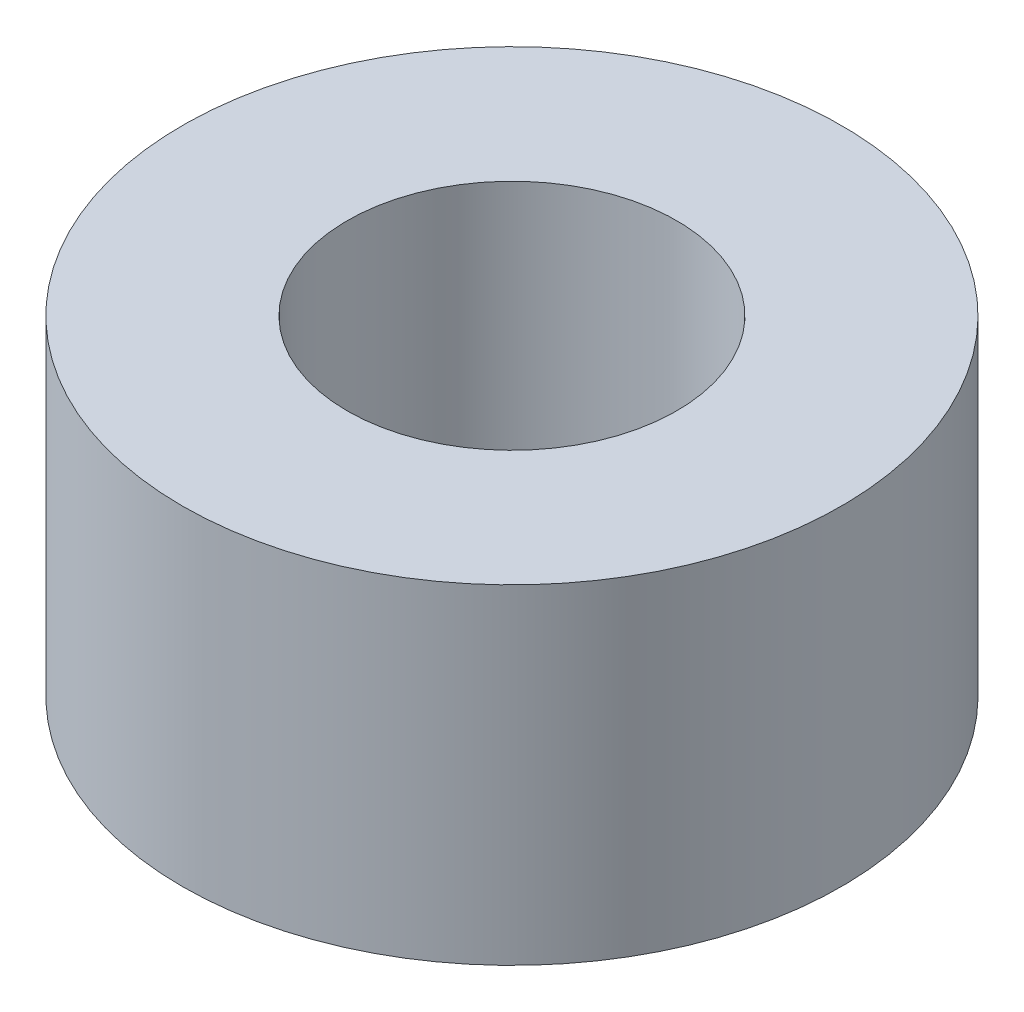
ISO-10303-21;
HEADER;
FILE_DESCRIPTION(('STEP AP214'),'2;1');
FILE_NAME('part.step','',(''),(''),'','','');
FILE_SCHEMA(('AUTOMOTIVE_DESIGN { 1 0 10303 214 1 1 1 1 }'));
ENDSEC;
DATA;
#1=APPLICATION_CONTEXT('core data for automotive mechanical design processes');
#2=APPLICATION_PROTOCOL_DEFINITION('international standard','automotive_design',2000,#1);
#3=PRODUCT_CONTEXT('',#1,'mechanical');
#4=PRODUCT('Part','Part','',(#3));
#5=PRODUCT_RELATED_PRODUCT_CATEGORY('part','',(#4));
#6=PRODUCT_DEFINITION_FORMATION('','',#4);
#7=PRODUCT_DEFINITION_CONTEXT('part definition',#1,'design');
#8=PRODUCT_DEFINITION('design','',#6,#7);
#9=PRODUCT_DEFINITION_SHAPE('','',#8);
#10=(LENGTH_UNIT() NAMED_UNIT(*) SI_UNIT(.MILLI.,.METRE.));
#11=(NAMED_UNIT(*) PLANE_ANGLE_UNIT() SI_UNIT($,.RADIAN.));
#12=(NAMED_UNIT(*) SI_UNIT($,.STERADIAN.) SOLID_ANGLE_UNIT());
#13=UNCERTAINTY_MEASURE_WITH_UNIT(LENGTH_MEASURE(1.E-05),#10,'distance_accuracy_value','');
#14=(GEOMETRIC_REPRESENTATION_CONTEXT(3) GLOBAL_UNCERTAINTY_ASSIGNED_CONTEXT((#13)) GLOBAL_UNIT_ASSIGNED_CONTEXT((#10,
#11,#12)) REPRESENTATION_CONTEXT('',''));
#15=CARTESIAN_POINT('',(0.,0.,0.));
#16=DIRECTION('',(0.,0.,1.));
#17=DIRECTION('',(1.,0.,0.));
#18=AXIS2_PLACEMENT_3D('',#15,#16,#17);
#19=CARTESIAN_POINT('',(0.,3.175,0.));
#20=DIRECTION('',(0.,1.,0.));
#21=DIRECTION('',(0.,0.,1.));
#22=AXIS2_PLACEMENT_3D('',#19,#20,#21);
#23=PLANE('',#22);
#24=CARTESIAN_POINT('',(0.,3.175,0.));
#25=DIRECTION('',(0.,1.,0.));
#26=DIRECTION('',(0.,0.,1.));
#27=AXIS2_PLACEMENT_3D('',#24,#25,#26);
#28=CIRCLE('',#27,3.175);
#29=CARTESIAN_POINT('',(0.,3.175,3.175));
#30=VERTEX_POINT('',#29);
#31=EDGE_CURVE('E10',#30,#30,#28,.T.);
#32=ORIENTED_EDGE('',*,*,#31,.T.);
#33=EDGE_LOOP('',(#32));
#34=FACE_BOUND('',#33,.T.);
#35=CARTESIAN_POINT('',(0.,3.175,0.));
#36=DIRECTION('',(0.,1.,0.));
#37=DIRECTION('',(0.,0.,1.));
#38=AXIS2_PLACEMENT_3D('',#35,#36,#37);
#39=CIRCLE('',#38,1.5875);
#40=CARTESIAN_POINT('',(0.,3.175,1.5875));
#41=VERTEX_POINT('',#40);
#42=EDGE_CURVE('E41',#41,#41,#39,.T.);
#43=ORIENTED_EDGE('',*,*,#42,.F.);
#44=EDGE_LOOP('',(#43));
#45=FACE_BOUND('',#44,.T.);
#46=ADVANCED_FACE('F30',(#34,#45),#23,.T.);
#47=CARTESIAN_POINT('',(0.,0.,0.));
#48=DIRECTION('',(0.,1.,0.));
#49=DIRECTION('',(0.,0.,1.));
#50=AXIS2_PLACEMENT_3D('',#47,#48,#49);
#51=PLANE('',#50);
#52=CARTESIAN_POINT('',(0.,0.,0.));
#53=DIRECTION('',(0.,1.,0.));
#54=DIRECTION('',(0.,0.,1.));
#55=AXIS2_PLACEMENT_3D('',#52,#53,#54);
#56=CIRCLE('',#55,3.175);
#57=CARTESIAN_POINT('',(0.,0.,3.175));
#58=VERTEX_POINT('',#57);
#59=EDGE_CURVE('E34',#58,#58,#56,.T.);
#60=ORIENTED_EDGE('',*,*,#59,.F.);
#61=EDGE_LOOP('',(#60));
#62=FACE_BOUND('',#61,.T.);
#63=CARTESIAN_POINT('',(0.,0.,0.));
#64=DIRECTION('',(0.,1.,0.));
#65=DIRECTION('',(0.,0.,1.));
#66=AXIS2_PLACEMENT_3D('',#63,#64,#65);
#67=CIRCLE('',#66,1.5875);
#68=CARTESIAN_POINT('',(0.,0.,1.5875));
#69=VERTEX_POINT('',#68);
#70=EDGE_CURVE('E43',#69,#69,#67,.T.);
#71=ORIENTED_EDGE('',*,*,#70,.T.);
#72=EDGE_LOOP('',(#71));
#73=FACE_BOUND('',#72,.T.);
#74=ADVANCED_FACE('F53',(#62,#73),#51,.F.);
#75=CARTESIAN_POINT('',(0.,3.175,0.));
#76=DIRECTION('',(0.,-1.,0.));
#77=DIRECTION('',(0.,0.,-1.));
#78=AXIS2_PLACEMENT_3D('',#75,#76,#77);
#79=CYLINDRICAL_SURFACE('',#78,3.175);
#80=ORIENTED_EDGE('',*,*,#31,.F.);
#81=EDGE_LOOP('',(#80));
#82=FACE_BOUND('',#81,.T.);
#83=ORIENTED_EDGE('',*,*,#59,.T.);
#84=EDGE_LOOP('',(#83));
#85=FACE_BOUND('',#84,.T.);
#86=ADVANCED_FACE('F32',(#82,#85),#79,.T.);
#87=CARTESIAN_POINT('',(0.,3.175,0.));
#88=DIRECTION('',(0.,-1.,0.));
#89=DIRECTION('',(0.,0.,-1.));
#90=AXIS2_PLACEMENT_3D('',#87,#88,#89);
#91=CYLINDRICAL_SURFACE('',#90,1.5875);
#92=ORIENTED_EDGE('',*,*,#42,.T.);
#93=EDGE_LOOP('',(#92));
#94=FACE_BOUND('',#93,.T.);
#95=ORIENTED_EDGE('',*,*,#70,.F.);
#96=EDGE_LOOP('',(#95));
#97=FACE_BOUND('',#96,.T.);
#98=ADVANCED_FACE('F49',(#94,#97),#91,.F.);
#99=CLOSED_SHELL('',(#46,#74,#86,#98));
#100=MANIFOLD_SOLID_BREP('B2',#99);
#101=ADVANCED_BREP_SHAPE_REPRESENTATION('',(#18,#100),#14);
#102=SHAPE_DEFINITION_REPRESENTATION(#9,#101);
ENDSEC;
END-ISO-10303-21;
